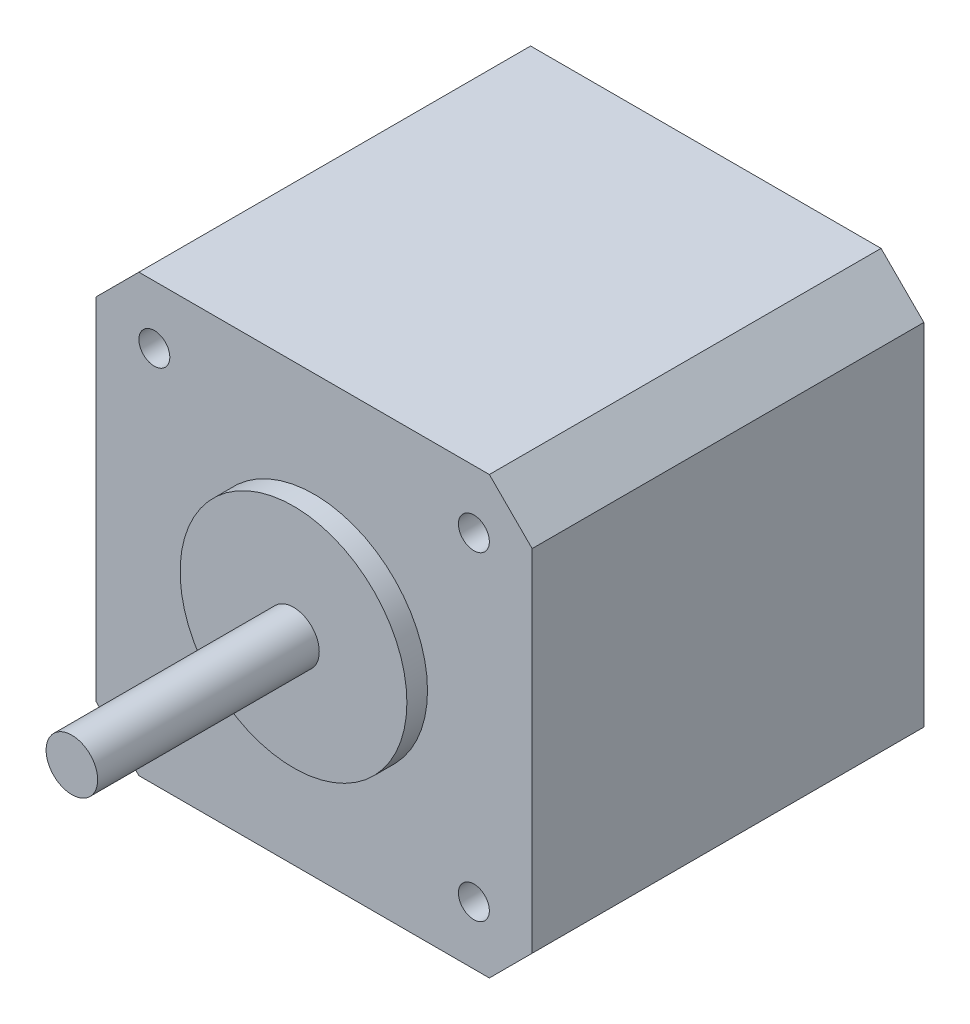
ISO-10303-21;
HEADER;
FILE_DESCRIPTION(('STEP AP214'),'2;1');
FILE_NAME('part.step','',(''),(''),'','','');
FILE_SCHEMA(('AUTOMOTIVE_DESIGN { 1 0 10303 214 1 1 1 1 }'));
ENDSEC;
DATA;
#1=APPLICATION_CONTEXT('core data for automotive mechanical design processes');
#2=APPLICATION_PROTOCOL_DEFINITION('international standard','automotive_design',2000,#1);
#3=PRODUCT_CONTEXT('',#1,'mechanical');
#4=PRODUCT('Part','Part','',(#3));
#5=PRODUCT_RELATED_PRODUCT_CATEGORY('part','',(#4));
#6=PRODUCT_DEFINITION_FORMATION('','',#4);
#7=PRODUCT_DEFINITION_CONTEXT('part definition',#1,'design');
#8=PRODUCT_DEFINITION('design','',#6,#7);
#9=PRODUCT_DEFINITION_SHAPE('','',#8);
#10=(LENGTH_UNIT() NAMED_UNIT(*) SI_UNIT(.MILLI.,.METRE.));
#11=(NAMED_UNIT(*) PLANE_ANGLE_UNIT() SI_UNIT($,.RADIAN.));
#12=(NAMED_UNIT(*) SI_UNIT($,.STERADIAN.) SOLID_ANGLE_UNIT());
#13=UNCERTAINTY_MEASURE_WITH_UNIT(LENGTH_MEASURE(1.E-05),#10,'distance_accuracy_value','');
#14=(GEOMETRIC_REPRESENTATION_CONTEXT(3) GLOBAL_UNCERTAINTY_ASSIGNED_CONTEXT((#13)) GLOBAL_UNIT_ASSIGNED_CONTEXT((#10,
#11,#12)) REPRESENTATION_CONTEXT('',''));
#15=CARTESIAN_POINT('',(0.,0.,0.));
#16=DIRECTION('',(0.,0.,1.));
#17=DIRECTION('',(1.,0.,0.));
#18=AXIS2_PLACEMENT_3D('',#15,#16,#17);
#19=CARTESIAN_POINT('',(-1.07144710476317,13.3950472938869,38.));
#20=DIRECTION('',(-0.707106781186548,-0.707106781186547,0.));
#21=DIRECTION('',(0.707106781186547,-0.707106781186548,0.));
#22=AXIS2_PLACEMENT_3D('',#19,#20,#21);
#23=PLANE('',#22);
#24=DIRECTION('',(-0.707106781186547,0.707106781186548,0.));
#25=VECTOR('',#24,1.);
#26=CARTESIAN_POINT('',(-1.07144710476317,13.3950472938869,0.));
#27=LINE('',#26,#25);
#28=CARTESIAN_POINT('',(3.07855289523684,9.24504729388686,0.));
#29=VERTEX_POINT('',#28);
#30=CARTESIAN_POINT('',(-1.07144710476317,13.3950472938869,0.));
#31=VERTEX_POINT('',#30);
#32=EDGE_CURVE('E136',#29,#31,#27,.T.);
#33=ORIENTED_EDGE('',*,*,#32,.T.);
#34=DIRECTION('',(0.,0.,-1.));
#35=VECTOR('',#34,1.);
#36=CARTESIAN_POINT('',(-1.07144710476317,13.3950472938869,38.));
#37=LINE('',#36,#35);
#38=CARTESIAN_POINT('',(-1.07144710476317,13.3950472938869,38.));
#39=VERTEX_POINT('',#38);
#40=EDGE_CURVE('E40',#39,#31,#37,.T.);
#41=ORIENTED_EDGE('',*,*,#40,.F.);
#42=DIRECTION('',(-0.707106781186547,0.707106781186548,0.));
#43=VECTOR('',#42,1.);
#44=CARTESIAN_POINT('',(-1.07144710476317,13.3950472938869,38.));
#45=LINE('',#44,#43);
#46=CARTESIAN_POINT('',(3.07855289523684,9.24504729388686,38.));
#47=VERTEX_POINT('',#46);
#48=EDGE_CURVE('E151',#47,#39,#45,.T.);
#49=ORIENTED_EDGE('',*,*,#48,.F.);
#50=DIRECTION('',(0.,0.,-1.));
#51=VECTOR('',#50,1.);
#52=CARTESIAN_POINT('',(3.07855289523684,9.24504729388686,38.));
#53=LINE('',#52,#51);
#54=EDGE_CURVE('E132',#47,#29,#53,.T.);
#55=ORIENTED_EDGE('',*,*,#54,.T.);
#56=EDGE_LOOP('',(#33,#41,#49,#55));
#57=FACE_BOUND('',#56,.T.);
#58=ADVANCED_FACE('F37',(#57),#23,.F.);
#59=CARTESIAN_POINT('',(-35.0714471047632,13.3950472938869,38.));
#60=DIRECTION('',(0.,-1.,0.));
#61=DIRECTION('',(0.,0.,-1.));
#62=AXIS2_PLACEMENT_3D('',#59,#60,#61);
#63=PLANE('',#62);
#64=DIRECTION('',(-1.,0.,0.));
#65=VECTOR('',#64,1.);
#66=CARTESIAN_POINT('',(-35.0714471047632,13.3950472938869,0.));
#67=LINE('',#66,#65);
#68=CARTESIAN_POINT('',(-35.0714471047632,13.3950472938869,0.));
#69=VERTEX_POINT('',#68);
#70=EDGE_CURVE('E139',#31,#69,#67,.T.);
#71=ORIENTED_EDGE('',*,*,#70,.T.);
#72=DIRECTION('',(0.,0.,-1.));
#73=VECTOR('',#72,1.);
#74=CARTESIAN_POINT('',(-35.0714471047632,13.3950472938869,38.));
#75=LINE('',#74,#73);
#76=CARTESIAN_POINT('',(-35.0714471047632,13.3950472938869,38.));
#77=VERTEX_POINT('',#76);
#78=EDGE_CURVE('E160',#77,#69,#75,.T.);
#79=ORIENTED_EDGE('',*,*,#78,.F.);
#80=DIRECTION('',(-1.,0.,0.));
#81=VECTOR('',#80,1.);
#82=CARTESIAN_POINT('',(-35.0714471047632,13.3950472938869,38.));
#83=LINE('',#82,#81);
#84=EDGE_CURVE('E99',#39,#77,#83,.T.);
#85=ORIENTED_EDGE('',*,*,#84,.F.);
#86=ORIENTED_EDGE('',*,*,#40,.T.);
#87=EDGE_LOOP('',(#71,#79,#85,#86));
#88=FACE_BOUND('',#87,.T.);
#89=ADVANCED_FACE('F203',(#88),#63,.F.);
#90=CARTESIAN_POINT('',(-39.2214471047632,9.24504729388685,38.));
#91=DIRECTION('',(0.707106781186551,-0.707106781186545,0.));
#92=DIRECTION('',(0.707106781186545,0.707106781186551,0.));
#93=AXIS2_PLACEMENT_3D('',#90,#91,#92);
#94=PLANE('',#93);
#95=DIRECTION('',(-0.707106781186545,-0.707106781186551,0.));
#96=VECTOR('',#95,1.);
#97=CARTESIAN_POINT('',(-39.2214471047632,9.24504729388685,0.));
#98=LINE('',#97,#96);
#99=CARTESIAN_POINT('',(-39.2214471047632,9.24504729388685,0.));
#100=VERTEX_POINT('',#99);
#101=EDGE_CURVE('E142',#69,#100,#98,.T.);
#102=ORIENTED_EDGE('',*,*,#101,.T.);
#103=DIRECTION('',(0.,0.,-1.));
#104=VECTOR('',#103,1.);
#105=CARTESIAN_POINT('',(-39.2214471047632,9.24504729388685,38.));
#106=LINE('',#105,#104);
#107=CARTESIAN_POINT('',(-39.2214471047632,9.24504729388685,38.));
#108=VERTEX_POINT('',#107);
#109=EDGE_CURVE('E158',#108,#100,#106,.T.);
#110=ORIENTED_EDGE('',*,*,#109,.F.);
#111=DIRECTION('',(-0.707106781186545,-0.707106781186551,0.));
#112=VECTOR('',#111,1.);
#113=CARTESIAN_POINT('',(-39.2214471047632,9.24504729388685,38.));
#114=LINE('',#113,#112);
#115=EDGE_CURVE('E174',#77,#108,#114,.T.);
#116=ORIENTED_EDGE('',*,*,#115,.F.);
#117=ORIENTED_EDGE('',*,*,#78,.T.);
#118=EDGE_LOOP('',(#102,#110,#116,#117));
#119=FACE_BOUND('',#118,.T.);
#120=ADVANCED_FACE('F207',(#119),#94,.F.);
#121=CARTESIAN_POINT('',(-39.2214471047632,9.24504729388685,38.));
#122=DIRECTION('',(1.,0.,0.));
#123=DIRECTION('',(0.,0.,-1.));
#124=AXIS2_PLACEMENT_3D('',#121,#122,#123);
#125=PLANE('',#124);
#126=DIRECTION('',(0.,-1.,0.));
#127=VECTOR('',#126,1.);
#128=CARTESIAN_POINT('',(-39.2214471047632,9.24504729388685,0.));
#129=LINE('',#128,#127);
#130=CARTESIAN_POINT('',(-39.2214471047632,-24.7549527061131,0.));
#131=VERTEX_POINT('',#130);
#132=EDGE_CURVE('E144',#100,#131,#129,.T.);
#133=ORIENTED_EDGE('',*,*,#132,.T.);
#134=DIRECTION('',(0.,0.,-1.));
#135=VECTOR('',#134,1.);
#136=CARTESIAN_POINT('',(-39.2214471047632,-24.7549527061131,38.));
#137=LINE('',#136,#135);
#138=CARTESIAN_POINT('',(-39.2214471047632,-24.7549527061131,38.));
#139=VERTEX_POINT('',#138);
#140=EDGE_CURVE('E155',#139,#131,#137,.T.);
#141=ORIENTED_EDGE('',*,*,#140,.F.);
#142=DIRECTION('',(0.,-1.,0.));
#143=VECTOR('',#142,1.);
#144=CARTESIAN_POINT('',(-39.2214471047632,9.24504729388685,38.));
#145=LINE('',#144,#143);
#146=EDGE_CURVE('E176',#108,#139,#145,.T.);
#147=ORIENTED_EDGE('',*,*,#146,.F.);
#148=ORIENTED_EDGE('',*,*,#109,.T.);
#149=EDGE_LOOP('',(#133,#141,#147,#148));
#150=FACE_BOUND('',#149,.T.);
#151=ADVANCED_FACE('F181',(#150),#125,.F.);
#152=CARTESIAN_POINT('',(-39.2214471047632,-24.7549527061131,38.));
#153=DIRECTION('',(0.707106781186548,0.707106781186548,0.));
#154=DIRECTION('',(-0.707106781186548,0.707106781186548,0.));
#155=AXIS2_PLACEMENT_3D('',#152,#153,#154);
#156=PLANE('',#155);
#157=DIRECTION('',(0.707106781186548,-0.707106781186548,0.));
#158=VECTOR('',#157,1.);
#159=CARTESIAN_POINT('',(-39.2214471047632,-24.7549527061131,0.));
#160=LINE('',#159,#158);
#161=CARTESIAN_POINT('',(-35.0714471047632,-28.9049527061131,0.));
#162=VERTEX_POINT('',#161);
#163=EDGE_CURVE('E146',#131,#162,#160,.T.);
#164=ORIENTED_EDGE('',*,*,#163,.T.);
#165=DIRECTION('',(0.,0.,-1.));
#166=VECTOR('',#165,1.);
#167=CARTESIAN_POINT('',(-35.0714471047632,-28.9049527061131,38.));
#168=LINE('',#167,#166);
#169=CARTESIAN_POINT('',(-35.0714471047632,-28.9049527061131,38.));
#170=VERTEX_POINT('',#169);
#171=EDGE_CURVE('E127',#170,#162,#168,.T.);
#172=ORIENTED_EDGE('',*,*,#171,.F.);
#173=DIRECTION('',(0.707106781186548,-0.707106781186548,0.));
#174=VECTOR('',#173,1.);
#175=CARTESIAN_POINT('',(-39.2214471047632,-24.7549527061131,38.));
#176=LINE('',#175,#174);
#177=EDGE_CURVE('E118',#139,#170,#176,.T.);
#178=ORIENTED_EDGE('',*,*,#177,.F.);
#179=ORIENTED_EDGE('',*,*,#140,.T.);
#180=EDGE_LOOP('',(#164,#172,#178,#179));
#181=FACE_BOUND('',#180,.T.);
#182=ADVANCED_FACE('F185',(#181),#156,.F.);
#183=CARTESIAN_POINT('',(-35.0714471047632,-28.9049527061131,38.));
#184=DIRECTION('',(0.,1.,0.));
#185=DIRECTION('',(-1.,0.,0.));
#186=AXIS2_PLACEMENT_3D('',#183,#184,#185);
#187=PLANE('',#186);
#188=DIRECTION('',(1.,0.,0.));
#189=VECTOR('',#188,1.);
#190=CARTESIAN_POINT('',(-35.0714471047632,-28.9049527061131,0.));
#191=LINE('',#190,#189);
#192=CARTESIAN_POINT('',(-1.07144710476311,-28.9049527061131,0.));
#193=VERTEX_POINT('',#192);
#194=EDGE_CURVE('E126',#162,#193,#191,.T.);
#195=ORIENTED_EDGE('',*,*,#194,.T.);
#196=DIRECTION('',(0.,0.,-1.));
#197=VECTOR('',#196,1.);
#198=CARTESIAN_POINT('',(-1.07144710476311,-28.9049527061131,38.));
#199=LINE('',#198,#197);
#200=CARTESIAN_POINT('',(-1.07144710476311,-28.9049527061131,38.));
#201=VERTEX_POINT('',#200);
#202=EDGE_CURVE('E123',#201,#193,#199,.T.);
#203=ORIENTED_EDGE('',*,*,#202,.F.);
#204=DIRECTION('',(1.,0.,0.));
#205=VECTOR('',#204,1.);
#206=CARTESIAN_POINT('',(-35.0714471047632,-28.9049527061131,38.));
#207=LINE('',#206,#205);
#208=EDGE_CURVE('E112',#170,#201,#207,.T.);
#209=ORIENTED_EDGE('',*,*,#208,.F.);
#210=ORIENTED_EDGE('',*,*,#171,.T.);
#211=EDGE_LOOP('',(#195,#203,#209,#210));
#212=FACE_BOUND('',#211,.T.);
#213=ADVANCED_FACE('F124',(#212),#187,.F.);
#214=CARTESIAN_POINT('',(3.07855289523684,-24.7549527061131,38.));
#215=DIRECTION('',(-0.707106781186557,0.707106781186538,0.));
#216=DIRECTION('',(-0.707106781186538,-0.707106781186557,0.));
#217=AXIS2_PLACEMENT_3D('',#214,#215,#216);
#218=PLANE('',#217);
#219=DIRECTION('',(0.707106781186538,0.707106781186557,0.));
#220=VECTOR('',#219,1.);
#221=CARTESIAN_POINT('',(3.07855289523684,-24.7549527061131,0.));
#222=LINE('',#221,#220);
#223=CARTESIAN_POINT('',(3.07855289523684,-24.7549527061131,0.));
#224=VERTEX_POINT('',#223);
#225=EDGE_CURVE('E84',#193,#224,#222,.T.);
#226=ORIENTED_EDGE('',*,*,#225,.T.);
#227=DIRECTION('',(0.,0.,-1.));
#228=VECTOR('',#227,1.);
#229=CARTESIAN_POINT('',(3.07855289523684,-24.7549527061131,38.));
#230=LINE('',#229,#228);
#231=CARTESIAN_POINT('',(3.07855289523684,-24.7549527061131,38.));
#232=VERTEX_POINT('',#231);
#233=EDGE_CURVE('E128',#232,#224,#230,.T.);
#234=ORIENTED_EDGE('',*,*,#233,.F.);
#235=DIRECTION('',(0.707106781186538,0.707106781186557,0.));
#236=VECTOR('',#235,1.);
#237=CARTESIAN_POINT('',(3.07855289523684,-24.7549527061131,38.));
#238=LINE('',#237,#236);
#239=EDGE_CURVE('E116',#201,#232,#238,.T.);
#240=ORIENTED_EDGE('',*,*,#239,.F.);
#241=ORIENTED_EDGE('',*,*,#202,.T.);
#242=EDGE_LOOP('',(#226,#234,#240,#241));
#243=FACE_BOUND('',#242,.T.);
#244=ADVANCED_FACE('F130',(#243),#218,.F.);
#245=CARTESIAN_POINT('',(3.07855289523684,9.24504729388686,38.));
#246=DIRECTION('',(-1.,0.,0.));
#247=DIRECTION('',(0.,-1.,0.));
#248=AXIS2_PLACEMENT_3D('',#245,#246,#247);
#249=PLANE('',#248);
#250=DIRECTION('',(0.,1.,0.));
#251=VECTOR('',#250,1.);
#252=CARTESIAN_POINT('',(3.07855289523684,9.24504729388686,0.));
#253=LINE('',#252,#251);
#254=EDGE_CURVE('E90',#224,#29,#253,.T.);
#255=ORIENTED_EDGE('',*,*,#254,.T.);
#256=ORIENTED_EDGE('',*,*,#54,.F.);
#257=DIRECTION('',(0.,1.,0.));
#258=VECTOR('',#257,1.);
#259=CARTESIAN_POINT('',(3.07855289523684,9.24504729388686,38.));
#260=LINE('',#259,#258);
#261=EDGE_CURVE('E55',#232,#47,#260,.T.);
#262=ORIENTED_EDGE('',*,*,#261,.F.);
#263=ORIENTED_EDGE('',*,*,#233,.T.);
#264=EDGE_LOOP('',(#255,#256,#262,#263));
#265=FACE_BOUND('',#264,.T.);
#266=ADVANCED_FACE('F191',(#265),#249,.F.);
#267=CARTESIAN_POINT('',(0.,0.,38.));
#268=DIRECTION('',(0.,0.,-1.));
#269=DIRECTION('',(-1.,0.,0.));
#270=AXIS2_PLACEMENT_3D('',#267,#268,#269);
#271=PLANE('',#270);
#272=CARTESIAN_POINT('',(-33.5714471047631,7.74504729388689,38.));
#273=DIRECTION('',(0.,0.,-1.));
#274=DIRECTION('',(-1.,0.,0.));
#275=AXIS2_PLACEMENT_3D('',#272,#273,#274);
#276=CIRCLE('',#275,1.5);
#277=CARTESIAN_POINT('',(-35.0714471047631,7.74504729388689,38.));
#278=VERTEX_POINT('',#277);
#279=EDGE_CURVE('E396',#278,#278,#276,.F.);
#280=ORIENTED_EDGE('',*,*,#279,.F.);
#281=EDGE_LOOP('',(#280));
#282=FACE_BOUND('',#281,.T.);
#283=CARTESIAN_POINT('',(-33.5714471047631,-23.2549527061131,38.));
#284=DIRECTION('',(0.,0.,-1.));
#285=DIRECTION('',(-1.,0.,0.));
#286=AXIS2_PLACEMENT_3D('',#283,#284,#285);
#287=CIRCLE('',#286,1.5);
#288=CARTESIAN_POINT('',(-35.0714471047631,-23.2549527061131,38.));
#289=VERTEX_POINT('',#288);
#290=EDGE_CURVE('E398',#289,#289,#287,.F.);
#291=ORIENTED_EDGE('',*,*,#290,.F.);
#292=EDGE_LOOP('',(#291));
#293=FACE_BOUND('',#292,.T.);
#294=CARTESIAN_POINT('',(-2.57144710476313,-23.2549527061131,38.));
#295=DIRECTION('',(0.,0.,-1.));
#296=DIRECTION('',(-1.,0.,0.));
#297=AXIS2_PLACEMENT_3D('',#294,#295,#296);
#298=CIRCLE('',#297,1.5);
#299=CARTESIAN_POINT('',(-4.07144710476313,-23.2549527061131,38.));
#300=VERTEX_POINT('',#299);
#301=EDGE_CURVE('E425',#300,#300,#298,.F.);
#302=ORIENTED_EDGE('',*,*,#301,.F.);
#303=EDGE_LOOP('',(#302));
#304=FACE_BOUND('',#303,.T.);
#305=CARTESIAN_POINT('',(-2.57144710476313,7.74504729388689,38.));
#306=DIRECTION('',(0.,0.,-1.));
#307=DIRECTION('',(-1.,0.,0.));
#308=AXIS2_PLACEMENT_3D('',#305,#306,#307);
#309=CIRCLE('',#308,1.5);
#310=CARTESIAN_POINT('',(-4.07144710476313,7.74504729388689,38.));
#311=VERTEX_POINT('',#310);
#312=EDGE_CURVE('E407',#311,#311,#309,.F.);
#313=ORIENTED_EDGE('',*,*,#312,.F.);
#314=EDGE_LOOP('',(#313));
#315=FACE_BOUND('',#314,.T.);
#316=CARTESIAN_POINT('',(-18.0714471047632,-7.75495270611311,38.));
#317=DIRECTION('',(0.,0.,1.));
#318=DIRECTION('',(1.,0.,0.));
#319=AXIS2_PLACEMENT_3D('',#316,#317,#318);
#320=CIRCLE('',#319,11.);
#321=CARTESIAN_POINT('',(-7.07144710476317,-7.75495270611311,38.));
#322=VERTEX_POINT('',#321);
#323=EDGE_CURVE('E46',#322,#322,#320,.T.);
#324=ORIENTED_EDGE('',*,*,#323,.F.);
#325=EDGE_LOOP('',(#324));
#326=FACE_BOUND('',#325,.T.);
#327=ORIENTED_EDGE('',*,*,#48,.T.);
#328=ORIENTED_EDGE('',*,*,#84,.T.);
#329=ORIENTED_EDGE('',*,*,#115,.T.);
#330=ORIENTED_EDGE('',*,*,#146,.T.);
#331=ORIENTED_EDGE('',*,*,#177,.T.);
#332=ORIENTED_EDGE('',*,*,#208,.T.);
#333=ORIENTED_EDGE('',*,*,#239,.T.);
#334=ORIENTED_EDGE('',*,*,#261,.T.);
#335=EDGE_LOOP('',(#327,#328,#329,#330,#331,#332,#333,#334));
#336=FACE_BOUND('',#335,.T.);
#337=ADVANCED_FACE('F114',(#282,#293,#304,#315,#326,#336),#271,.F.);
#338=CARTESIAN_POINT('',(0.,0.,0.));
#339=DIRECTION('',(0.,0.,-1.));
#340=DIRECTION('',(-1.,0.,0.));
#341=AXIS2_PLACEMENT_3D('',#338,#339,#340);
#342=PLANE('',#341);
#343=CARTESIAN_POINT('',(-33.5714471047631,7.74504729388689,0.));
#344=DIRECTION('',(0.,0.,-1.));
#345=DIRECTION('',(1.,0.,0.));
#346=AXIS2_PLACEMENT_3D('',#343,#344,#345);
#347=CIRCLE('',#346,1.5);
#348=CARTESIAN_POINT('',(-32.0714471047631,7.74504729388689,0.));
#349=VERTEX_POINT('',#348);
#350=EDGE_CURVE('E393',#349,#349,#347,.T.);
#351=ORIENTED_EDGE('',*,*,#350,.F.);
#352=EDGE_LOOP('',(#351));
#353=FACE_BOUND('',#352,.T.);
#354=CARTESIAN_POINT('',(-33.5714471047631,-23.2549527061131,0.));
#355=DIRECTION('',(0.,0.,-1.));
#356=DIRECTION('',(1.,0.,0.));
#357=AXIS2_PLACEMENT_3D('',#354,#355,#356);
#358=CIRCLE('',#357,1.5);
#359=CARTESIAN_POINT('',(-32.0714471047631,-23.2549527061131,0.));
#360=VERTEX_POINT('',#359);
#361=EDGE_CURVE('E401',#360,#360,#358,.T.);
#362=ORIENTED_EDGE('',*,*,#361,.F.);
#363=EDGE_LOOP('',(#362));
#364=FACE_BOUND('',#363,.T.);
#365=CARTESIAN_POINT('',(-2.57144710476313,-23.2549527061131,0.));
#366=DIRECTION('',(0.,0.,-1.));
#367=DIRECTION('',(-1.,0.,0.));
#368=AXIS2_PLACEMENT_3D('',#365,#366,#367);
#369=CIRCLE('',#368,1.5);
#370=CARTESIAN_POINT('',(-4.07144710476313,-23.2549527061131,0.));
#371=VERTEX_POINT('',#370);
#372=EDGE_CURVE('E408',#371,#371,#369,.T.);
#373=ORIENTED_EDGE('',*,*,#372,.F.);
#374=EDGE_LOOP('',(#373));
#375=FACE_BOUND('',#374,.T.);
#376=CARTESIAN_POINT('',(-2.57144710476313,7.74504729388689,0.));
#377=DIRECTION('',(0.,0.,-1.));
#378=DIRECTION('',(-1.,0.,0.));
#379=AXIS2_PLACEMENT_3D('',#376,#377,#378);
#380=CIRCLE('',#379,1.5);
#381=CARTESIAN_POINT('',(-4.07144710476313,7.74504729388689,0.));
#382=VERTEX_POINT('',#381);
#383=EDGE_CURVE('E404',#382,#382,#380,.T.);
#384=ORIENTED_EDGE('',*,*,#383,.F.);
#385=EDGE_LOOP('',(#384));
#386=FACE_BOUND('',#385,.T.);
#387=ORIENTED_EDGE('',*,*,#32,.F.);
#388=ORIENTED_EDGE('',*,*,#254,.F.);
#389=ORIENTED_EDGE('',*,*,#225,.F.);
#390=ORIENTED_EDGE('',*,*,#194,.F.);
#391=ORIENTED_EDGE('',*,*,#163,.F.);
#392=ORIENTED_EDGE('',*,*,#132,.F.);
#393=ORIENTED_EDGE('',*,*,#101,.F.);
#394=ORIENTED_EDGE('',*,*,#70,.F.);
#395=EDGE_LOOP('',(#387,#388,#389,#390,#391,#392,#393,#394));
#396=FACE_BOUND('',#395,.T.);
#397=ADVANCED_FACE('F188',(#353,#364,#375,#386,#396),#342,.T.);
#398=CARTESIAN_POINT('',(-18.0714471047632,-7.75495270611311,40.));
#399=DIRECTION('',(0.,0.,-1.));
#400=DIRECTION('',(-1.,0.,0.));
#401=AXIS2_PLACEMENT_3D('',#398,#399,#400);
#402=CYLINDRICAL_SURFACE('',#401,11.);
#403=CARTESIAN_POINT('',(-18.0714471047632,-7.75495270611311,40.));
#404=DIRECTION('',(0.,0.,1.));
#405=DIRECTION('',(1.,0.,0.));
#406=AXIS2_PLACEMENT_3D('',#403,#404,#405);
#407=CIRCLE('',#406,11.);
#408=CARTESIAN_POINT('',(-7.07144710476317,-7.75495270611311,40.));
#409=VERTEX_POINT('',#408);
#410=EDGE_CURVE('E140',#409,#409,#407,.T.);
#411=ORIENTED_EDGE('',*,*,#410,.F.);
#412=EDGE_LOOP('',(#411));
#413=FACE_BOUND('',#412,.T.);
#414=ORIENTED_EDGE('',*,*,#323,.T.);
#415=EDGE_LOOP('',(#414));
#416=FACE_BOUND('',#415,.T.);
#417=ADVANCED_FACE('F238',(#413,#416),#402,.T.);
#418=CARTESIAN_POINT('',(-18.0714471047632,-7.75495270611311,40.));
#419=DIRECTION('',(0.,0.,1.));
#420=DIRECTION('',(1.,0.,0.));
#421=AXIS2_PLACEMENT_3D('',#418,#419,#420);
#422=PLANE('',#421);
#423=CARTESIAN_POINT('',(-18.0714471047632,-7.75495270611311,40.));
#424=DIRECTION('',(0.,0.,1.));
#425=DIRECTION('',(1.,0.,0.));
#426=AXIS2_PLACEMENT_3D('',#423,#424,#425);
#427=CIRCLE('',#426,2.5);
#428=CARTESIAN_POINT('',(-15.5714471047632,-7.75495270611311,40.));
#429=VERTEX_POINT('',#428);
#430=EDGE_CURVE('E11',#429,#429,#427,.T.);
#431=ORIENTED_EDGE('',*,*,#430,.F.);
#432=EDGE_LOOP('',(#431));
#433=FACE_BOUND('',#432,.T.);
#434=ORIENTED_EDGE('',*,*,#410,.T.);
#435=EDGE_LOOP('',(#434));
#436=FACE_BOUND('',#435,.T.);
#437=ADVANCED_FACE('F243',(#433,#436),#422,.T.);
#438=CARTESIAN_POINT('',(-18.0714471047632,-7.75495270611311,61.5));
#439=DIRECTION('',(0.,0.,-1.));
#440=DIRECTION('',(-1.,0.,0.));
#441=AXIS2_PLACEMENT_3D('',#438,#439,#440);
#442=CYLINDRICAL_SURFACE('',#441,2.5);
#443=CARTESIAN_POINT('',(-18.0714471047632,-7.75495270611311,61.5));
#444=DIRECTION('',(0.,0.,1.));
#445=DIRECTION('',(1.,0.,0.));
#446=AXIS2_PLACEMENT_3D('',#443,#444,#445);
#447=CIRCLE('',#446,2.5);
#448=CARTESIAN_POINT('',(-15.5714471047632,-7.75495270611311,61.5));
#449=VERTEX_POINT('',#448);
#450=EDGE_CURVE('E411',#449,#449,#447,.T.);
#451=ORIENTED_EDGE('',*,*,#450,.F.);
#452=EDGE_LOOP('',(#451));
#453=FACE_BOUND('',#452,.T.);
#454=ORIENTED_EDGE('',*,*,#430,.T.);
#455=EDGE_LOOP('',(#454));
#456=FACE_BOUND('',#455,.T.);
#457=ADVANCED_FACE('F256',(#453,#456),#442,.T.);
#458=CARTESIAN_POINT('',(-18.0714471047632,-7.75495270611311,61.5));
#459=DIRECTION('',(0.,0.,1.));
#460=DIRECTION('',(1.,0.,0.));
#461=AXIS2_PLACEMENT_3D('',#458,#459,#460);
#462=PLANE('',#461);
#463=ORIENTED_EDGE('',*,*,#450,.T.);
#464=EDGE_LOOP('',(#463));
#465=FACE_BOUND('',#464,.T.);
#466=ADVANCED_FACE('F267',(#465),#462,.T.);
#467=CARTESIAN_POINT('',(-2.57144710476313,7.74504729388689,61.501));
#468=DIRECTION('',(0.,0.,-1.));
#469=DIRECTION('',(-1.,0.,0.));
#470=AXIS2_PLACEMENT_3D('',#467,#468,#469);
#471=CYLINDRICAL_SURFACE('',#470,1.5);
#472=ORIENTED_EDGE('',*,*,#383,.T.);
#473=EDGE_LOOP('',(#472));
#474=FACE_BOUND('',#473,.T.);
#475=ORIENTED_EDGE('',*,*,#312,.T.);
#476=EDGE_LOOP('',(#475));
#477=FACE_BOUND('',#476,.T.);
#478=ADVANCED_FACE('F278',(#474,#477),#471,.F.);
#479=CARTESIAN_POINT('',(-2.57144710476313,-23.2549527061131,61.501));
#480=DIRECTION('',(0.,0.,-1.));
#481=DIRECTION('',(-1.,0.,0.));
#482=AXIS2_PLACEMENT_3D('',#479,#480,#481);
#483=CYLINDRICAL_SURFACE('',#482,1.5);
#484=ORIENTED_EDGE('',*,*,#372,.T.);
#485=EDGE_LOOP('',(#484));
#486=FACE_BOUND('',#485,.T.);
#487=ORIENTED_EDGE('',*,*,#301,.T.);
#488=EDGE_LOOP('',(#487));
#489=FACE_BOUND('',#488,.T.);
#490=ADVANCED_FACE('F302',(#486,#489),#483,.F.);
#491=CARTESIAN_POINT('',(-33.5714471047631,-23.2549527061131,61.501));
#492=DIRECTION('',(0.,0.,-1.));
#493=DIRECTION('',(-1.,0.,0.));
#494=AXIS2_PLACEMENT_3D('',#491,#492,#493);
#495=CYLINDRICAL_SURFACE('',#494,1.5);
#496=ORIENTED_EDGE('',*,*,#361,.T.);
#497=EDGE_LOOP('',(#496));
#498=FACE_BOUND('',#497,.T.);
#499=ORIENTED_EDGE('',*,*,#290,.T.);
#500=EDGE_LOOP('',(#499));
#501=FACE_BOUND('',#500,.T.);
#502=ADVANCED_FACE('F313',(#498,#501),#495,.F.);
#503=CARTESIAN_POINT('',(-33.5714471047631,7.74504729388689,61.501));
#504=DIRECTION('',(0.,0.,-1.));
#505=DIRECTION('',(-1.,0.,0.));
#506=AXIS2_PLACEMENT_3D('',#503,#504,#505);
#507=CYLINDRICAL_SURFACE('',#506,1.5);
#508=ORIENTED_EDGE('',*,*,#350,.T.);
#509=EDGE_LOOP('',(#508));
#510=FACE_BOUND('',#509,.T.);
#511=ORIENTED_EDGE('',*,*,#279,.T.);
#512=EDGE_LOOP('',(#511));
#513=FACE_BOUND('',#512,.T.);
#514=ADVANCED_FACE('F324',(#510,#513),#507,.F.);
#515=CLOSED_SHELL('',(#58,#89,#120,#151,#182,#213,#244,#266,#337,#397,#417,#437,#457,#466,#478,
#490,#502,#514));
#516=MANIFOLD_SOLID_BREP('B2',#515);
#517=ADVANCED_BREP_SHAPE_REPRESENTATION('',(#18,#516),#14);
#518=SHAPE_DEFINITION_REPRESENTATION(#9,#517);
ENDSEC;
END-ISO-10303-21;
